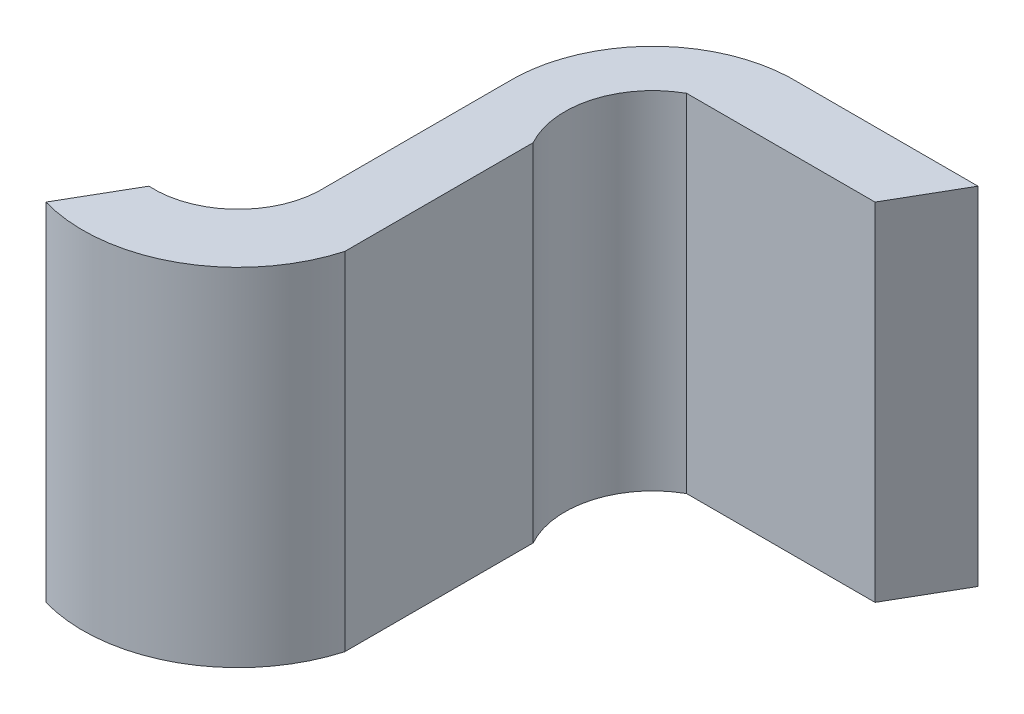
ISO-10303-21;
HEADER;
FILE_DESCRIPTION(('STEP AP214'),'2;1');
FILE_NAME('part.step','',(''),(''),'','','');
FILE_SCHEMA(('AUTOMOTIVE_DESIGN { 1 0 10303 214 1 1 1 1 }'));
ENDSEC;
DATA;
#1=APPLICATION_CONTEXT('core data for automotive mechanical design processes');
#2=APPLICATION_PROTOCOL_DEFINITION('international standard','automotive_design',2000,#1);
#3=PRODUCT_CONTEXT('',#1,'mechanical');
#4=PRODUCT('Part','Part','',(#3));
#5=PRODUCT_RELATED_PRODUCT_CATEGORY('part','',(#4));
#6=PRODUCT_DEFINITION_FORMATION('','',#4);
#7=PRODUCT_DEFINITION_CONTEXT('part definition',#1,'design');
#8=PRODUCT_DEFINITION('design','',#6,#7);
#9=PRODUCT_DEFINITION_SHAPE('','',#8);
#10=(LENGTH_UNIT() NAMED_UNIT(*) SI_UNIT(.MILLI.,.METRE.));
#11=(NAMED_UNIT(*) PLANE_ANGLE_UNIT() SI_UNIT($,.RADIAN.));
#12=(NAMED_UNIT(*) SI_UNIT($,.STERADIAN.) SOLID_ANGLE_UNIT());
#13=UNCERTAINTY_MEASURE_WITH_UNIT(LENGTH_MEASURE(1.E-05),#10,'distance_accuracy_value','');
#14=(GEOMETRIC_REPRESENTATION_CONTEXT(3) GLOBAL_UNCERTAINTY_ASSIGNED_CONTEXT((#13)) GLOBAL_UNIT_ASSIGNED_CONTEXT((#10,
#11,#12)) REPRESENTATION_CONTEXT('',''));
#15=CARTESIAN_POINT('',(0.,0.,0.));
#16=DIRECTION('',(0.,0.,1.));
#17=DIRECTION('',(1.,0.,0.));
#18=AXIS2_PLACEMENT_3D('',#15,#16,#17);
#19=CARTESIAN_POINT('',(0.243301270189,-0.23,0.01160254037844));
#20=DIRECTION('',(0.,0.,-1.));
#21=DIRECTION('',(-1.,0.,0.));
#22=AXIS2_PLACEMENT_3D('',#19,#20,#21);
#23=PLANE('',#22);
#24=DIRECTION('',(1.,0.,0.));
#25=VECTOR('',#24,1.);
#26=CARTESIAN_POINT('',(0.343301270189,-0.23,0.01160254037844));
#27=LINE('',#26,#25);
#28=CARTESIAN_POINT('',(0.243301270192627,-0.23,0.0116025403785745));
#29=VERTEX_POINT('',#28);
#30=CARTESIAN_POINT('',(0.493301270189,-0.23,0.01160254037844));
#31=VERTEX_POINT('',#30);
#32=EDGE_CURVE('E83',#29,#31,#27,.T.);
#33=ORIENTED_EDGE('',*,*,#32,.F.);
#34=DIRECTION('',(0.,1.,0.));
#35=VECTOR('',#34,1.);
#36=CARTESIAN_POINT('',(0.243301270189009,-0.23,0.0116025403787031));
#37=LINE('',#36,#35);
#38=CARTESIAN_POINT('',(0.243301270192627,0.23,0.0116025403785745));
#39=VERTEX_POINT('',#38);
#40=EDGE_CURVE('E175',#39,#29,#37,.F.);
#41=ORIENTED_EDGE('',*,*,#40,.F.);
#42=DIRECTION('',(1.,0.,0.));
#43=VECTOR('',#42,1.);
#44=CARTESIAN_POINT('',(0.343301270189,0.23,0.01160254037844));
#45=LINE('',#44,#43);
#46=CARTESIAN_POINT('',(0.493301270189,0.23,0.01160254037844));
#47=VERTEX_POINT('',#46);
#48=EDGE_CURVE('E105',#47,#39,#45,.F.);
#49=ORIENTED_EDGE('',*,*,#48,.F.);
#50=DIRECTION('',(0.,1.,0.));
#51=VECTOR('',#50,1.);
#52=CARTESIAN_POINT('',(0.493301270189,-0.23,0.01160254037844));
#53=LINE('',#52,#51);
#54=EDGE_CURVE('E93',#47,#31,#53,.F.);
#55=ORIENTED_EDGE('',*,*,#54,.T.);
#56=EDGE_LOOP('',(#33,#41,#49,#55));
#57=FACE_BOUND('',#56,.T.);
#58=ADVANCED_FACE('F17',(#57),#23,.T.);
#59=CARTESIAN_POINT('',(0.493301270189,-0.23,0.01160254037844));
#60=DIRECTION('',(-0.866025403784329,0.,-0.50000000000019));
#61=DIRECTION('',(-0.50000000000019,0.,0.866025403784329));
#62=AXIS2_PLACEMENT_3D('',#59,#60,#61);
#63=PLANE('',#62);
#64=DIRECTION('',(0.499999999999973,0.,-0.866025403784454));
#65=VECTOR('',#64,1.);
#66=CARTESIAN_POINT('',(0.443301270189,0.23,0.09820508075689));
#67=LINE('',#66,#65);
#68=CARTESIAN_POINT('',(0.443301270189,0.23,0.09820508075689));
#69=VERTEX_POINT('',#68);
#70=EDGE_CURVE('E98',#69,#47,#67,.T.);
#71=ORIENTED_EDGE('',*,*,#70,.F.);
#72=DIRECTION('',(0.,1.,0.));
#73=VECTOR('',#72,1.);
#74=CARTESIAN_POINT('',(0.443301270189,0.23,0.09820508075689));
#75=LINE('',#74,#73);
#76=CARTESIAN_POINT('',(0.443301270188993,-0.23,0.0982050807568858));
#77=VERTEX_POINT('',#76);
#78=EDGE_CURVE('E102',#77,#69,#75,.T.);
#79=ORIENTED_EDGE('',*,*,#78,.F.);
#80=DIRECTION('',(-0.50000000000019,0.,0.866025403784329));
#81=VECTOR('',#80,1.);
#82=CARTESIAN_POINT('',(0.493301270189,-0.23,0.01160254037844));
#83=LINE('',#82,#81);
#84=EDGE_CURVE('E126',#31,#77,#83,.T.);
#85=ORIENTED_EDGE('',*,*,#84,.F.);
#86=ORIENTED_EDGE('',*,*,#54,.F.);
#87=EDGE_LOOP('',(#71,#79,#85,#86));
#88=FACE_BOUND('',#87,.T.);
#89=ADVANCED_FACE('F100',(#88),#63,.F.);
#90=CARTESIAN_POINT('',(0.25,-0.23,0.2));
#91=DIRECTION('',(0.,1.,0.));
#92=DIRECTION('',(0.,0.,1.));
#93=AXIS2_PLACEMENT_3D('',#90,#91,#92);
#94=CYLINDRICAL_SURFACE('',#93,0.188516513263);
#95=CARTESIAN_POINT('',(0.25,-0.23,0.2));
#96=DIRECTION('',(0.,1.,0.));
#97=DIRECTION('',(0.,0.,1.));
#98=AXIS2_PLACEMENT_3D('',#95,#96,#97);
#99=CIRCLE('',#98,0.188516513263);
#100=CARTESIAN_POINT('',(0.0616025403785745,-0.23,0.206698729807373));
#101=VERTEX_POINT('',#100);
#102=EDGE_CURVE('E20',#29,#101,#99,.T.);
#103=ORIENTED_EDGE('',*,*,#102,.T.);
#104=DIRECTION('',(0.,1.,0.));
#105=VECTOR('',#104,1.);
#106=CARTESIAN_POINT('',(0.06160254037844,-0.23,0.206698729811));
#107=LINE('',#106,#105);
#108=CARTESIAN_POINT('',(0.0616025403785745,0.23,0.206698729807373));
#109=VERTEX_POINT('',#108);
#110=EDGE_CURVE('E157',#109,#101,#107,.F.);
#111=ORIENTED_EDGE('',*,*,#110,.F.);
#112=CARTESIAN_POINT('',(0.25,0.23,0.2));
#113=DIRECTION('',(0.,1.,0.));
#114=DIRECTION('',(0.,0.,1.));
#115=AXIS2_PLACEMENT_3D('',#112,#113,#114);
#116=CIRCLE('',#115,0.188516513263);
#117=EDGE_CURVE('E115',#109,#39,#116,.F.);
#118=ORIENTED_EDGE('',*,*,#117,.T.);
#119=ORIENTED_EDGE('',*,*,#40,.T.);
#120=EDGE_LOOP('',(#103,#111,#118,#119));
#121=FACE_BOUND('',#120,.T.);
#122=ADVANCED_FACE('F180',(#121),#94,.T.);
#123=CARTESIAN_POINT('',(0.193301270189,0.23,0.09820508075689));
#124=DIRECTION('',(0.,0.,1.));
#125=DIRECTION('',(1.,0.,0.));
#126=AXIS2_PLACEMENT_3D('',#123,#124,#125);
#127=PLANE('',#126);
#128=DIRECTION('',(1.,0.,0.));
#129=VECTOR('',#128,1.);
#130=CARTESIAN_POINT('',(0.193301270189,0.23,0.09820508075689));
#131=LINE('',#130,#129);
#132=CARTESIAN_POINT('',(0.193301270189198,0.23,0.0982050807571993));
#133=VERTEX_POINT('',#132);
#134=EDGE_CURVE('E108',#69,#133,#131,.F.);
#135=ORIENTED_EDGE('',*,*,#134,.T.);
#136=DIRECTION('',(0.,1.,0.));
#137=VECTOR('',#136,1.);
#138=CARTESIAN_POINT('',(0.193301270189178,0.23,0.0982050807572103));
#139=LINE('',#138,#137);
#140=CARTESIAN_POINT('',(0.193301270189198,-0.23,0.0982050807571993));
#141=VERTEX_POINT('',#140);
#142=EDGE_CURVE('E153',#133,#141,#139,.F.);
#143=ORIENTED_EDGE('',*,*,#142,.T.);
#144=DIRECTION('',(1.,0.,0.));
#145=VECTOR('',#144,1.);
#146=CARTESIAN_POINT('',(0.193301270189,-0.23,0.09820508075689));
#147=LINE('',#146,#145);
#148=EDGE_CURVE('E118',#141,#77,#147,.T.);
#149=ORIENTED_EDGE('',*,*,#148,.T.);
#150=ORIENTED_EDGE('',*,*,#78,.T.);
#151=EDGE_LOOP('',(#135,#143,#149,#150));
#152=FACE_BOUND('',#151,.T.);
#153=ADVANCED_FACE('F117',(#152),#127,.T.);
#154=CARTESIAN_POINT('',(0.06160254037844,-0.23,0.456698729811));
#155=DIRECTION('',(-1.,0.,0.));
#156=DIRECTION('',(0.,0.,1.));
#157=AXIS2_PLACEMENT_3D('',#154,#155,#156);
#158=PLANE('',#157);
#159=DIRECTION('',(0.,0.,-1.));
#160=VECTOR('',#159,1.);
#161=CARTESIAN_POINT('',(0.06160254037844,-0.23,0.356698729811));
#162=LINE('',#161,#160);
#163=CARTESIAN_POINT('',(0.06160254037844,-0.23,0.456698729811009));
#164=VERTEX_POINT('',#163);
#165=EDGE_CURVE('E155',#164,#101,#162,.T.);
#166=ORIENTED_EDGE('',*,*,#165,.F.);
#167=DIRECTION('',(0.,-1.,0.));
#168=VECTOR('',#167,1.);
#169=CARTESIAN_POINT('',(0.0616025403784411,-0.23,0.456698729811));
#170=LINE('',#169,#168);
#171=CARTESIAN_POINT('',(0.06160254037844,0.23,0.456698729811009));
#172=VERTEX_POINT('',#171);
#173=EDGE_CURVE('E151',#164,#172,#170,.F.);
#174=ORIENTED_EDGE('',*,*,#173,.T.);
#175=DIRECTION('',(0.,0.,1.));
#176=VECTOR('',#175,1.);
#177=CARTESIAN_POINT('',(0.06160254037844,0.23,0.356698729811));
#178=LINE('',#177,#176);
#179=EDGE_CURVE('E170',#109,#172,#178,.T.);
#180=ORIENTED_EDGE('',*,*,#179,.F.);
#181=ORIENTED_EDGE('',*,*,#110,.T.);
#182=EDGE_LOOP('',(#166,#174,#180,#181));
#183=FACE_BOUND('',#182,.T.);
#184=ADVANCED_FACE('F186',(#183),#158,.T.);
#185=CARTESIAN_POINT('',(0.25,0.23,0.2));
#186=DIRECTION('',(0.,1.,0.));
#187=DIRECTION('',(0.,0.,1.));
#188=AXIS2_PLACEMENT_3D('',#185,#186,#187);
#189=CYLINDRICAL_SURFACE('',#188,0.116520176561);
#190=CARTESIAN_POINT('',(0.25,0.23,0.2));
#191=DIRECTION('',(0.,1.,0.));
#192=DIRECTION('',(0.,0.,1.));
#193=AXIS2_PLACEMENT_3D('',#190,#191,#192);
#194=CIRCLE('',#193,0.116520176561);
#195=CARTESIAN_POINT('',(0.148205080757228,0.23,0.256698729810854));
#196=VERTEX_POINT('',#195);
#197=EDGE_CURVE('E111',#196,#133,#194,.F.);
#198=ORIENTED_EDGE('',*,*,#197,.F.);
#199=DIRECTION('',(0.,1.,0.));
#200=VECTOR('',#199,1.);
#201=CARTESIAN_POINT('',(0.148205080757,0.23,0.256698729811));
#202=LINE('',#201,#200);
#203=CARTESIAN_POINT('',(0.148205080757228,-0.23,0.256698729810854));
#204=VERTEX_POINT('',#203);
#205=EDGE_CURVE('E194',#204,#196,#202,.T.);
#206=ORIENTED_EDGE('',*,*,#205,.F.);
#207=CARTESIAN_POINT('',(0.25,-0.23,0.2));
#208=DIRECTION('',(0.,1.,0.));
#209=DIRECTION('',(0.,0.,1.));
#210=AXIS2_PLACEMENT_3D('',#207,#208,#209);
#211=CIRCLE('',#210,0.116520176561);
#212=EDGE_CURVE('E154',#141,#204,#211,.T.);
#213=ORIENTED_EDGE('',*,*,#212,.F.);
#214=ORIENTED_EDGE('',*,*,#142,.F.);
#215=EDGE_LOOP('',(#198,#206,#213,#214));
#216=FACE_BOUND('',#215,.T.);
#217=ADVANCED_FACE('F258',(#216),#189,.F.);
#218=CARTESIAN_POINT('',(-0.05,-0.23,0.45));
#219=DIRECTION('',(0.,-1.,0.));
#220=DIRECTION('',(0.,0.,-1.));
#221=AXIS2_PLACEMENT_3D('',#218,#219,#220);
#222=CYLINDRICAL_SURFACE('',#221,0.111803398875);
#223=CARTESIAN_POINT('',(-0.05,-0.23,0.45));
#224=DIRECTION('',(0.,-1.,0.));
#225=DIRECTION('',(0.,0.,-1.));
#226=AXIS2_PLACEMENT_3D('',#223,#224,#225);
#227=CIRCLE('',#226,0.111803398875);
#228=CARTESIAN_POINT('',(-0.0566987298109068,-0.23,0.56160254037822));
#229=VERTEX_POINT('',#228);
#230=EDGE_CURVE('E148',#164,#229,#227,.T.);
#231=ORIENTED_EDGE('',*,*,#230,.T.);
#232=DIRECTION('',(0.,1.,0.));
#233=VECTOR('',#232,1.);
#234=CARTESIAN_POINT('',(-0.05669872981078,-0.23,0.561602540378));
#235=LINE('',#234,#233);
#236=CARTESIAN_POINT('',(-0.0566987298109068,0.23,0.56160254037822));
#237=VERTEX_POINT('',#236);
#238=EDGE_CURVE('E142',#237,#229,#235,.F.);
#239=ORIENTED_EDGE('',*,*,#238,.F.);
#240=CARTESIAN_POINT('',(-0.05,0.23,0.45));
#241=DIRECTION('',(0.,-1.,0.));
#242=DIRECTION('',(0.,0.,-1.));
#243=AXIS2_PLACEMENT_3D('',#240,#241,#242);
#244=CIRCLE('',#243,0.111803398875);
#245=EDGE_CURVE('E143',#237,#172,#244,.F.);
#246=ORIENTED_EDGE('',*,*,#245,.T.);
#247=ORIENTED_EDGE('',*,*,#173,.F.);
#248=EDGE_LOOP('',(#231,#239,#246,#247));
#249=FACE_BOUND('',#248,.T.);
#250=ADVANCED_FACE('F188',(#249),#222,.F.);
#251=CARTESIAN_POINT('',(0.03711914807983,-0.23,0.581947921688));
#252=DIRECTION('',(0.,1.,0.));
#253=DIRECTION('',(0.,0.,1.));
#254=AXIS2_PLACEMENT_3D('',#251,#252,#253);
#255=PLANE('',#254);
#256=CARTESIAN_POINT('',(-0.05,-0.23,0.45));
#257=DIRECTION('',(0.,-1.,0.));
#258=DIRECTION('',(0.,0.,-1.));
#259=AXIS2_PLACEMENT_3D('',#256,#257,#258);
#260=CIRCLE('',#259,0.206155281281);
#261=CARTESIAN_POINT('',(-0.106698729811034,-0.23,0.648205080756936));
#262=VERTEX_POINT('',#261);
#263=CARTESIAN_POINT('',(0.148205080757,-0.23,0.506698729810905));
#264=VERTEX_POINT('',#263);
#265=EDGE_CURVE('E139',#262,#264,#260,.F.);
#266=ORIENTED_EDGE('',*,*,#265,.F.);
#267=DIRECTION('',(-0.50000000000019,0.,0.866025403784329));
#268=VECTOR('',#267,1.);
#269=CARTESIAN_POINT('',(-0.05669872981078,-0.23,0.561602540378));
#270=LINE('',#269,#268);
#271=EDGE_CURVE('E146',#229,#262,#270,.T.);
#272=ORIENTED_EDGE('',*,*,#271,.F.);
#273=ORIENTED_EDGE('',*,*,#230,.F.);
#274=ORIENTED_EDGE('',*,*,#165,.T.);
#275=ORIENTED_EDGE('',*,*,#102,.F.);
#276=ORIENTED_EDGE('',*,*,#32,.T.);
#277=ORIENTED_EDGE('',*,*,#84,.T.);
#278=ORIENTED_EDGE('',*,*,#148,.F.);
#279=ORIENTED_EDGE('',*,*,#212,.T.);
#280=DIRECTION('',(0.,0.,-1.));
#281=VECTOR('',#280,1.);
#282=CARTESIAN_POINT('',(0.148205080757,-0.23,0.506698729811));
#283=LINE('',#282,#281);
#284=EDGE_CURVE('E150',#264,#204,#283,.T.);
#285=ORIENTED_EDGE('',*,*,#284,.F.);
#286=EDGE_LOOP('',(#266,#272,#273,#274,#275,#276,#277,#278,#279,#285));
#287=FACE_BOUND('',#286,.T.);
#288=ADVANCED_FACE('F182',(#287),#255,.F.);
#289=CARTESIAN_POINT('',(0.148205080757,0.23,0.506698729811));
#290=DIRECTION('',(1.,0.,0.));
#291=DIRECTION('',(0.,0.,-1.));
#292=AXIS2_PLACEMENT_3D('',#289,#290,#291);
#293=PLANE('',#292);
#294=DIRECTION('',(0.,0.,-1.));
#295=VECTOR('',#294,1.);
#296=CARTESIAN_POINT('',(0.148205080757,0.23,0.506698729811));
#297=LINE('',#296,#295);
#298=CARTESIAN_POINT('',(0.148205080757,0.23,0.506698729810905));
#299=VERTEX_POINT('',#298);
#300=EDGE_CURVE('E147',#196,#299,#297,.F.);
#301=ORIENTED_EDGE('',*,*,#300,.T.);
#302=DIRECTION('',(0.,-1.,0.));
#303=VECTOR('',#302,1.);
#304=CARTESIAN_POINT('',(0.14820508075695,0.23,0.506698729810986));
#305=LINE('',#304,#303);
#306=EDGE_CURVE('E138',#264,#299,#305,.F.);
#307=ORIENTED_EDGE('',*,*,#306,.F.);
#308=ORIENTED_EDGE('',*,*,#284,.T.);
#309=ORIENTED_EDGE('',*,*,#205,.T.);
#310=EDGE_LOOP('',(#301,#307,#308,#309));
#311=FACE_BOUND('',#310,.T.);
#312=ADVANCED_FACE('F211',(#311),#293,.T.);
#313=CARTESIAN_POINT('',(0.03711914807983,0.23,0.581947921688));
#314=DIRECTION('',(0.,-1.,0.));
#315=DIRECTION('',(0.,0.,-1.));
#316=AXIS2_PLACEMENT_3D('',#313,#314,#315);
#317=PLANE('',#316);
#318=ORIENTED_EDGE('',*,*,#245,.F.);
#319=DIRECTION('',(-0.50000000000019,0.,0.866025403784329));
#320=VECTOR('',#319,1.);
#321=CARTESIAN_POINT('',(-0.05669872981078,0.23,0.561602540378));
#322=LINE('',#321,#320);
#323=CARTESIAN_POINT('',(-0.106698729811034,0.23,0.648205080756936));
#324=VERTEX_POINT('',#323);
#325=EDGE_CURVE('E35',#324,#237,#322,.F.);
#326=ORIENTED_EDGE('',*,*,#325,.F.);
#327=CARTESIAN_POINT('',(-0.05,0.23,0.45));
#328=DIRECTION('',(0.,-1.,0.));
#329=DIRECTION('',(0.,0.,-1.));
#330=AXIS2_PLACEMENT_3D('',#327,#328,#329);
#331=CIRCLE('',#330,0.206155281281);
#332=EDGE_CURVE('E26',#299,#324,#331,.T.);
#333=ORIENTED_EDGE('',*,*,#332,.F.);
#334=ORIENTED_EDGE('',*,*,#300,.F.);
#335=ORIENTED_EDGE('',*,*,#197,.T.);
#336=ORIENTED_EDGE('',*,*,#134,.F.);
#337=ORIENTED_EDGE('',*,*,#70,.T.);
#338=ORIENTED_EDGE('',*,*,#48,.T.);
#339=ORIENTED_EDGE('',*,*,#117,.F.);
#340=ORIENTED_EDGE('',*,*,#179,.T.);
#341=EDGE_LOOP('',(#318,#326,#333,#334,#335,#336,#337,#338,#339,#340));
#342=FACE_BOUND('',#341,.T.);
#343=ADVANCED_FACE('F109',(#342),#317,.F.);
#344=CARTESIAN_POINT('',(-0.05669872981078,-0.23,0.561602540378));
#345=DIRECTION('',(-0.866025403784329,0.,-0.50000000000019));
#346=DIRECTION('',(-0.50000000000019,0.,0.866025403784329));
#347=AXIS2_PLACEMENT_3D('',#344,#345,#346);
#348=PLANE('',#347);
#349=ORIENTED_EDGE('',*,*,#325,.T.);
#350=ORIENTED_EDGE('',*,*,#238,.T.);
#351=ORIENTED_EDGE('',*,*,#271,.T.);
#352=DIRECTION('',(0.,-1.,0.));
#353=VECTOR('',#352,1.);
#354=CARTESIAN_POINT('',(-0.106698729810986,0.23,0.64820508075695));
#355=LINE('',#354,#353);
#356=EDGE_CURVE('E11',#324,#262,#355,.T.);
#357=ORIENTED_EDGE('',*,*,#356,.F.);
#358=EDGE_LOOP('',(#349,#350,#351,#357));
#359=FACE_BOUND('',#358,.T.);
#360=ADVANCED_FACE('F219',(#359),#348,.T.);
#361=CARTESIAN_POINT('',(-0.05,0.23,0.45));
#362=DIRECTION('',(0.,-1.,0.));
#363=DIRECTION('',(0.,0.,-1.));
#364=AXIS2_PLACEMENT_3D('',#361,#362,#363);
#365=CYLINDRICAL_SURFACE('',#364,0.206155281281);
#366=ORIENTED_EDGE('',*,*,#332,.T.);
#367=ORIENTED_EDGE('',*,*,#356,.T.);
#368=ORIENTED_EDGE('',*,*,#265,.T.);
#369=ORIENTED_EDGE('',*,*,#306,.T.);
#370=EDGE_LOOP('',(#366,#367,#368,#369));
#371=FACE_BOUND('',#370,.T.);
#372=ADVANCED_FACE('F210',(#371),#365,.T.);
#373=CLOSED_SHELL('',(#58,#89,#122,#153,#184,#217,#250,#288,#312,#343,#360,#372));
#374=MANIFOLD_SOLID_BREP('B1',#373);
#375=ADVANCED_BREP_SHAPE_REPRESENTATION('',(#18,#374),#14);
#376=SHAPE_DEFINITION_REPRESENTATION(#9,#375);
ENDSEC;
END-ISO-10303-21;
